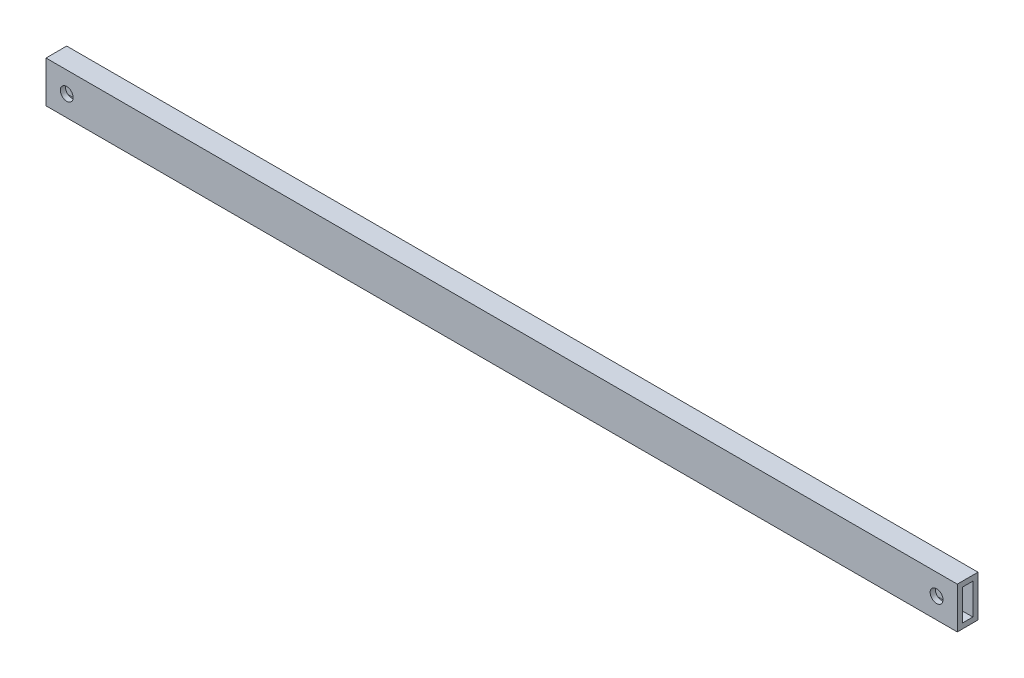
ISO-10303-21;
HEADER;
FILE_DESCRIPTION(('STEP AP214'),'2;1');
FILE_NAME('part.step','',(''),(''),'','','');
FILE_SCHEMA(('AUTOMOTIVE_DESIGN { 1 0 10303 214 1 1 1 1 }'));
ENDSEC;
DATA;
#1=APPLICATION_CONTEXT('core data for automotive mechanical design processes');
#2=APPLICATION_PROTOCOL_DEFINITION('international standard','automotive_design',2000,#1);
#3=PRODUCT_CONTEXT('',#1,'mechanical');
#4=PRODUCT('Part','Part','',(#3));
#5=PRODUCT_RELATED_PRODUCT_CATEGORY('part','',(#4));
#6=PRODUCT_DEFINITION_FORMATION('','',#4);
#7=PRODUCT_DEFINITION_CONTEXT('part definition',#1,'design');
#8=PRODUCT_DEFINITION('design','',#6,#7);
#9=PRODUCT_DEFINITION_SHAPE('','',#8);
#10=(LENGTH_UNIT() NAMED_UNIT(*) SI_UNIT(.MILLI.,.METRE.));
#11=(NAMED_UNIT(*) PLANE_ANGLE_UNIT() SI_UNIT($,.RADIAN.));
#12=(NAMED_UNIT(*) SI_UNIT($,.STERADIAN.) SOLID_ANGLE_UNIT());
#13=UNCERTAINTY_MEASURE_WITH_UNIT(LENGTH_MEASURE(1.E-05),#10,'distance_accuracy_value','');
#14=(GEOMETRIC_REPRESENTATION_CONTEXT(3) GLOBAL_UNCERTAINTY_ASSIGNED_CONTEXT((#13)) GLOBAL_UNIT_ASSIGNED_CONTEXT((#10,
#11,#12)) REPRESENTATION_CONTEXT('',''));
#15=CARTESIAN_POINT('',(0.,0.,0.));
#16=DIRECTION('',(0.,0.,1.));
#17=DIRECTION('',(1.,0.,0.));
#18=AXIS2_PLACEMENT_3D('',#15,#16,#17);
#19=CARTESIAN_POINT('',(558.8,0.,0.));
#20=DIRECTION('',(-1.,0.,0.));
#21=DIRECTION('',(0.,0.,1.));
#22=AXIS2_PLACEMENT_3D('',#19,#20,#21);
#23=PLANE('',#22);
#24=DIRECTION('',(0.,1.,0.));
#25=VECTOR('',#24,1.);
#26=CARTESIAN_POINT('',(558.8,-12.7,-6.35));
#27=LINE('',#26,#25);
#28=CARTESIAN_POINT('',(558.8,-12.7,-6.35));
#29=VERTEX_POINT('',#28);
#30=CARTESIAN_POINT('',(558.8,12.7,-6.35));
#31=VERTEX_POINT('',#30);
#32=EDGE_CURVE('E146',#29,#31,#27,.T.);
#33=ORIENTED_EDGE('',*,*,#32,.T.);
#34=DIRECTION('',(0.,0.,1.));
#35=VECTOR('',#34,1.);
#36=CARTESIAN_POINT('',(558.8,12.7,6.35));
#37=LINE('',#36,#35);
#38=CARTESIAN_POINT('',(558.8,12.7,6.35));
#39=VERTEX_POINT('',#38);
#40=EDGE_CURVE('E149',#31,#39,#37,.T.);
#41=ORIENTED_EDGE('',*,*,#40,.T.);
#42=DIRECTION('',(0.,-1.,0.));
#43=VECTOR('',#42,1.);
#44=CARTESIAN_POINT('',(558.8,-12.7,6.35));
#45=LINE('',#44,#43);
#46=CARTESIAN_POINT('',(558.8,-12.7,6.35));
#47=VERTEX_POINT('',#46);
#48=EDGE_CURVE('E152',#39,#47,#45,.T.);
#49=ORIENTED_EDGE('',*,*,#48,.T.);
#50=DIRECTION('',(0.,0.,-1.));
#51=VECTOR('',#50,1.);
#52=CARTESIAN_POINT('',(558.8,-12.7,6.35));
#53=LINE('',#52,#51);
#54=EDGE_CURVE('E154',#47,#29,#53,.T.);
#55=ORIENTED_EDGE('',*,*,#54,.T.);
#56=EDGE_LOOP('',(#33,#41,#49,#55));
#57=FACE_BOUND('',#56,.T.);
#58=DIRECTION('',(0.,-1.,0.));
#59=VECTOR('',#58,1.);
#60=CARTESIAN_POINT('',(558.8,-9.525,3.175));
#61=LINE('',#60,#59);
#62=CARTESIAN_POINT('',(558.8,9.525,3.175));
#63=VERTEX_POINT('',#62);
#64=CARTESIAN_POINT('',(558.8,-9.525,3.175));
#65=VERTEX_POINT('',#64);
#66=EDGE_CURVE('E104',#63,#65,#61,.T.);
#67=ORIENTED_EDGE('',*,*,#66,.F.);
#68=DIRECTION('',(0.,0.,1.));
#69=VECTOR('',#68,1.);
#70=CARTESIAN_POINT('',(558.8,9.525,3.175));
#71=LINE('',#70,#69);
#72=CARTESIAN_POINT('',(558.8,9.525,-3.175));
#73=VERTEX_POINT('',#72);
#74=EDGE_CURVE('E127',#73,#63,#71,.T.);
#75=ORIENTED_EDGE('',*,*,#74,.F.);
#76=DIRECTION('',(0.,1.,0.));
#77=VECTOR('',#76,1.);
#78=CARTESIAN_POINT('',(558.8,-9.525,-3.175));
#79=LINE('',#78,#77);
#80=CARTESIAN_POINT('',(558.8,-9.525,-3.175));
#81=VERTEX_POINT('',#80);
#82=EDGE_CURVE('E125',#81,#73,#79,.T.);
#83=ORIENTED_EDGE('',*,*,#82,.F.);
#84=DIRECTION('',(0.,0.,-1.));
#85=VECTOR('',#84,1.);
#86=CARTESIAN_POINT('',(558.8,-9.525,3.175));
#87=LINE('',#86,#85);
#88=EDGE_CURVE('E112',#65,#81,#87,.T.);
#89=ORIENTED_EDGE('',*,*,#88,.F.);
#90=EDGE_LOOP('',(#67,#75,#83,#89));
#91=FACE_BOUND('',#90,.T.);
#92=ADVANCED_FACE('F36',(#57,#91),#23,.F.);
#93=CARTESIAN_POINT('',(0.,0.,0.));
#94=DIRECTION('',(-1.,0.,0.));
#95=DIRECTION('',(0.,0.,1.));
#96=AXIS2_PLACEMENT_3D('',#93,#94,#95);
#97=PLANE('',#96);
#98=DIRECTION('',(0.,1.,0.));
#99=VECTOR('',#98,1.);
#100=CARTESIAN_POINT('',(0.,-12.7,-6.35));
#101=LINE('',#100,#99);
#102=CARTESIAN_POINT('',(0.,-12.7,-6.35));
#103=VERTEX_POINT('',#102);
#104=CARTESIAN_POINT('',(0.,12.7,-6.35));
#105=VERTEX_POINT('',#104);
#106=EDGE_CURVE('E121',#103,#105,#101,.T.);
#107=ORIENTED_EDGE('',*,*,#106,.F.);
#108=DIRECTION('',(0.,0.,-1.));
#109=VECTOR('',#108,1.);
#110=CARTESIAN_POINT('',(0.,-12.7,6.35));
#111=LINE('',#110,#109);
#112=CARTESIAN_POINT('',(0.,-12.7,6.35));
#113=VERTEX_POINT('',#112);
#114=EDGE_CURVE('E150',#113,#103,#111,.T.);
#115=ORIENTED_EDGE('',*,*,#114,.F.);
#116=DIRECTION('',(0.,-1.,0.));
#117=VECTOR('',#116,1.);
#118=CARTESIAN_POINT('',(0.,-12.7,6.35));
#119=LINE('',#118,#117);
#120=CARTESIAN_POINT('',(0.,12.7,6.35));
#121=VERTEX_POINT('',#120);
#122=EDGE_CURVE('E161',#121,#113,#119,.T.);
#123=ORIENTED_EDGE('',*,*,#122,.F.);
#124=DIRECTION('',(0.,0.,1.));
#125=VECTOR('',#124,1.);
#126=CARTESIAN_POINT('',(0.,12.7,6.35));
#127=LINE('',#126,#125);
#128=EDGE_CURVE('E159',#105,#121,#127,.T.);
#129=ORIENTED_EDGE('',*,*,#128,.F.);
#130=EDGE_LOOP('',(#107,#115,#123,#129));
#131=FACE_BOUND('',#130,.T.);
#132=DIRECTION('',(0.,0.,1.));
#133=VECTOR('',#132,1.);
#134=CARTESIAN_POINT('',(0.,9.525,3.175));
#135=LINE('',#134,#133);
#136=CARTESIAN_POINT('',(0.,9.525,-3.175));
#137=VERTEX_POINT('',#136);
#138=CARTESIAN_POINT('',(0.,9.525,3.175));
#139=VERTEX_POINT('',#138);
#140=EDGE_CURVE('E113',#137,#139,#135,.T.);
#141=ORIENTED_EDGE('',*,*,#140,.T.);
#142=DIRECTION('',(0.,-1.,0.));
#143=VECTOR('',#142,1.);
#144=CARTESIAN_POINT('',(0.,-9.525,3.175));
#145=LINE('',#144,#143);
#146=CARTESIAN_POINT('',(0.,-9.525,3.175));
#147=VERTEX_POINT('',#146);
#148=EDGE_CURVE('E62',#139,#147,#145,.T.);
#149=ORIENTED_EDGE('',*,*,#148,.T.);
#150=DIRECTION('',(0.,0.,-1.));
#151=VECTOR('',#150,1.);
#152=CARTESIAN_POINT('',(0.,-9.525,3.175));
#153=LINE('',#152,#151);
#154=CARTESIAN_POINT('',(0.,-9.525,-3.175));
#155=VERTEX_POINT('',#154);
#156=EDGE_CURVE('E119',#147,#155,#153,.T.);
#157=ORIENTED_EDGE('',*,*,#156,.T.);
#158=DIRECTION('',(0.,1.,0.));
#159=VECTOR('',#158,1.);
#160=CARTESIAN_POINT('',(0.,-9.525,-3.175));
#161=LINE('',#160,#159);
#162=EDGE_CURVE('E135',#155,#137,#161,.T.);
#163=ORIENTED_EDGE('',*,*,#162,.T.);
#164=EDGE_LOOP('',(#141,#149,#157,#163));
#165=FACE_BOUND('',#164,.T.);
#166=ADVANCED_FACE('F218',(#131,#165),#97,.T.);
#167=CARTESIAN_POINT('',(558.8,-12.7,-6.35));
#168=DIRECTION('',(0.,0.,1.));
#169=DIRECTION('',(1.,0.,0.));
#170=AXIS2_PLACEMENT_3D('',#167,#168,#169);
#171=PLANE('',#170);
#172=CARTESIAN_POINT('',(12.7000000000056,0.,-6.35));
#173=DIRECTION('',(0.,0.,1.));
#174=DIRECTION('',(-1.,0.,0.));
#175=AXIS2_PLACEMENT_3D('',#172,#173,#174);
#176=CIRCLE('',#175,3.35279999999993);
#177=CARTESIAN_POINT('',(9.34720000000566,0.,-6.35));
#178=VERTEX_POINT('',#177);
#179=EDGE_CURVE('E181',#178,#178,#176,.T.);
#180=ORIENTED_EDGE('',*,*,#179,.T.);
#181=EDGE_LOOP('',(#180));
#182=FACE_BOUND('',#181,.T.);
#183=CARTESIAN_POINT('',(546.099999999994,0.,-6.35));
#184=DIRECTION('',(0.,0.,1.));
#185=DIRECTION('',(1.,0.,0.));
#186=AXIS2_PLACEMENT_3D('',#183,#184,#185);
#187=CIRCLE('',#186,3.35279999999993);
#188=CARTESIAN_POINT('',(549.452799999994,0.,-6.35));
#189=VERTEX_POINT('',#188);
#190=EDGE_CURVE('E174',#189,#189,#187,.T.);
#191=ORIENTED_EDGE('',*,*,#190,.T.);
#192=EDGE_LOOP('',(#191));
#193=FACE_BOUND('',#192,.T.);
#194=ORIENTED_EDGE('',*,*,#106,.T.);
#195=DIRECTION('',(-1.,0.,0.));
#196=VECTOR('',#195,1.);
#197=CARTESIAN_POINT('',(558.8,12.7,-6.35));
#198=LINE('',#197,#196);
#199=EDGE_CURVE('E11',#31,#105,#198,.T.);
#200=ORIENTED_EDGE('',*,*,#199,.F.);
#201=ORIENTED_EDGE('',*,*,#32,.F.);
#202=DIRECTION('',(-1.,0.,0.));
#203=VECTOR('',#202,1.);
#204=CARTESIAN_POINT('',(558.8,-12.7,-6.35));
#205=LINE('',#204,#203);
#206=EDGE_CURVE('E156',#29,#103,#205,.T.);
#207=ORIENTED_EDGE('',*,*,#206,.T.);
#208=EDGE_LOOP('',(#194,#200,#201,#207));
#209=FACE_BOUND('',#208,.T.);
#210=ADVANCED_FACE('F38',(#182,#193,#209),#171,.F.);
#211=CARTESIAN_POINT('',(558.8,12.7,6.35));
#212=DIRECTION('',(0.,-1.,0.));
#213=DIRECTION('',(0.,0.,-1.));
#214=AXIS2_PLACEMENT_3D('',#211,#212,#213);
#215=PLANE('',#214);
#216=ORIENTED_EDGE('',*,*,#128,.T.);
#217=DIRECTION('',(-1.,0.,0.));
#218=VECTOR('',#217,1.);
#219=CARTESIAN_POINT('',(558.8,12.7,6.35));
#220=LINE('',#219,#218);
#221=EDGE_CURVE('E46',#39,#121,#220,.T.);
#222=ORIENTED_EDGE('',*,*,#221,.F.);
#223=ORIENTED_EDGE('',*,*,#40,.F.);
#224=ORIENTED_EDGE('',*,*,#199,.T.);
#225=EDGE_LOOP('',(#216,#222,#223,#224));
#226=FACE_BOUND('',#225,.T.);
#227=ADVANCED_FACE('F204',(#226),#215,.F.);
#228=CARTESIAN_POINT('',(558.8,-12.7,6.35));
#229=DIRECTION('',(0.,0.,-1.));
#230=DIRECTION('',(-1.,0.,0.));
#231=AXIS2_PLACEMENT_3D('',#228,#229,#230);
#232=PLANE('',#231);
#233=CARTESIAN_POINT('',(12.7000000000056,0.,6.35));
#234=DIRECTION('',(0.,0.,1.));
#235=DIRECTION('',(1.,0.,0.));
#236=AXIS2_PLACEMENT_3D('',#233,#234,#235);
#237=CIRCLE('',#236,3.937);
#238=CARTESIAN_POINT('',(16.6370000000056,0.,6.35));
#239=VERTEX_POINT('',#238);
#240=EDGE_CURVE('E189',#239,#239,#237,.T.);
#241=ORIENTED_EDGE('',*,*,#240,.F.);
#242=EDGE_LOOP('',(#241));
#243=FACE_BOUND('',#242,.T.);
#244=CARTESIAN_POINT('',(546.099999999994,0.,6.35));
#245=DIRECTION('',(0.,0.,1.));
#246=DIRECTION('',(1.,0.,0.));
#247=AXIS2_PLACEMENT_3D('',#244,#245,#246);
#248=CIRCLE('',#247,3.93700000000005);
#249=CARTESIAN_POINT('',(550.036999999994,0.,6.35));
#250=VERTEX_POINT('',#249);
#251=EDGE_CURVE('E185',#250,#250,#248,.T.);
#252=ORIENTED_EDGE('',*,*,#251,.F.);
#253=EDGE_LOOP('',(#252));
#254=FACE_BOUND('',#253,.T.);
#255=ORIENTED_EDGE('',*,*,#122,.T.);
#256=DIRECTION('',(-1.,0.,0.));
#257=VECTOR('',#256,1.);
#258=CARTESIAN_POINT('',(558.8,-12.7,6.35));
#259=LINE('',#258,#257);
#260=EDGE_CURVE('E167',#47,#113,#259,.T.);
#261=ORIENTED_EDGE('',*,*,#260,.F.);
#262=ORIENTED_EDGE('',*,*,#48,.F.);
#263=ORIENTED_EDGE('',*,*,#221,.T.);
#264=EDGE_LOOP('',(#255,#261,#262,#263));
#265=FACE_BOUND('',#264,.T.);
#266=ADVANCED_FACE('F200',(#243,#254,#265),#232,.F.);
#267=CARTESIAN_POINT('',(558.8,-12.7,6.35));
#268=DIRECTION('',(0.,1.,0.));
#269=DIRECTION('',(0.,0.,1.));
#270=AXIS2_PLACEMENT_3D('',#267,#268,#269);
#271=PLANE('',#270);
#272=ORIENTED_EDGE('',*,*,#114,.T.);
#273=ORIENTED_EDGE('',*,*,#206,.F.);
#274=ORIENTED_EDGE('',*,*,#54,.F.);
#275=ORIENTED_EDGE('',*,*,#260,.T.);
#276=EDGE_LOOP('',(#272,#273,#274,#275));
#277=FACE_BOUND('',#276,.T.);
#278=ADVANCED_FACE('F203',(#277),#271,.F.);
#279=CARTESIAN_POINT('',(558.8,-9.525,3.175));
#280=DIRECTION('',(0.,0.,-1.));
#281=DIRECTION('',(-1.,0.,0.));
#282=AXIS2_PLACEMENT_3D('',#279,#280,#281);
#283=PLANE('',#282);
#284=CARTESIAN_POINT('',(12.7000000000056,0.,3.175));
#285=DIRECTION('',(0.,0.,-1.));
#286=DIRECTION('',(-1.,0.,0.));
#287=AXIS2_PLACEMENT_3D('',#284,#285,#286);
#288=CIRCLE('',#287,3.937);
#289=CARTESIAN_POINT('',(8.7630000000056,0.,3.175));
#290=VERTEX_POINT('',#289);
#291=EDGE_CURVE('E192',#290,#290,#288,.F.);
#292=ORIENTED_EDGE('',*,*,#291,.T.);
#293=EDGE_LOOP('',(#292));
#294=FACE_BOUND('',#293,.T.);
#295=CARTESIAN_POINT('',(546.099999999994,0.,3.175));
#296=DIRECTION('',(0.,0.,-1.));
#297=DIRECTION('',(-1.,0.,0.));
#298=AXIS2_PLACEMENT_3D('',#295,#296,#297);
#299=CIRCLE('',#298,3.93700000000005);
#300=CARTESIAN_POINT('',(542.162999999994,0.,3.175));
#301=VERTEX_POINT('',#300);
#302=EDGE_CURVE('E186',#301,#301,#299,.F.);
#303=ORIENTED_EDGE('',*,*,#302,.T.);
#304=EDGE_LOOP('',(#303));
#305=FACE_BOUND('',#304,.T.);
#306=ORIENTED_EDGE('',*,*,#148,.F.);
#307=DIRECTION('',(-1.,0.,0.));
#308=VECTOR('',#307,1.);
#309=CARTESIAN_POINT('',(558.8,9.525,3.175));
#310=LINE('',#309,#308);
#311=EDGE_CURVE('E108',#63,#139,#310,.T.);
#312=ORIENTED_EDGE('',*,*,#311,.F.);
#313=ORIENTED_EDGE('',*,*,#66,.T.);
#314=DIRECTION('',(-1.,0.,0.));
#315=VECTOR('',#314,1.);
#316=CARTESIAN_POINT('',(558.8,-9.525,3.175));
#317=LINE('',#316,#315);
#318=EDGE_CURVE('E107',#65,#147,#317,.T.);
#319=ORIENTED_EDGE('',*,*,#318,.T.);
#320=EDGE_LOOP('',(#306,#312,#313,#319));
#321=FACE_BOUND('',#320,.T.);
#322=ADVANCED_FACE('F106',(#294,#305,#321),#283,.T.);
#323=CARTESIAN_POINT('',(558.8,-9.525,3.175));
#324=DIRECTION('',(0.,1.,0.));
#325=DIRECTION('',(0.,0.,1.));
#326=AXIS2_PLACEMENT_3D('',#323,#324,#325);
#327=PLANE('',#326);
#328=ORIENTED_EDGE('',*,*,#156,.F.);
#329=ORIENTED_EDGE('',*,*,#318,.F.);
#330=ORIENTED_EDGE('',*,*,#88,.T.);
#331=DIRECTION('',(-1.,0.,0.));
#332=VECTOR('',#331,1.);
#333=CARTESIAN_POINT('',(558.8,-9.525,-3.175));
#334=LINE('',#333,#332);
#335=EDGE_CURVE('E122',#81,#155,#334,.T.);
#336=ORIENTED_EDGE('',*,*,#335,.T.);
#337=EDGE_LOOP('',(#328,#329,#330,#336));
#338=FACE_BOUND('',#337,.T.);
#339=ADVANCED_FACE('F116',(#338),#327,.T.);
#340=CARTESIAN_POINT('',(558.8,-9.525,-3.175));
#341=DIRECTION('',(0.,0.,1.));
#342=DIRECTION('',(0.,-1.,0.));
#343=AXIS2_PLACEMENT_3D('',#340,#341,#342);
#344=PLANE('',#343);
#345=CARTESIAN_POINT('',(12.7000000000056,0.,-3.175));
#346=DIRECTION('',(0.,0.,1.));
#347=DIRECTION('',(0.,-1.,0.));
#348=AXIS2_PLACEMENT_3D('',#345,#346,#347);
#349=CIRCLE('',#348,3.35279999999993);
#350=CARTESIAN_POINT('',(12.7000000000056,-3.35279999999993,-3.175));
#351=VERTEX_POINT('',#350);
#352=EDGE_CURVE('E40',#351,#351,#349,.T.);
#353=ORIENTED_EDGE('',*,*,#352,.F.);
#354=EDGE_LOOP('',(#353));
#355=FACE_BOUND('',#354,.T.);
#356=CARTESIAN_POINT('',(546.099999999994,0.,-3.175));
#357=DIRECTION('',(0.,0.,1.));
#358=DIRECTION('',(0.,-1.,0.));
#359=AXIS2_PLACEMENT_3D('',#356,#357,#358);
#360=CIRCLE('',#359,3.35279999999993);
#361=CARTESIAN_POINT('',(546.099999999994,-3.35279999999993,-3.175));
#362=VERTEX_POINT('',#361);
#363=EDGE_CURVE('E133',#362,#362,#360,.T.);
#364=ORIENTED_EDGE('',*,*,#363,.F.);
#365=EDGE_LOOP('',(#364));
#366=FACE_BOUND('',#365,.T.);
#367=ORIENTED_EDGE('',*,*,#162,.F.);
#368=ORIENTED_EDGE('',*,*,#335,.F.);
#369=ORIENTED_EDGE('',*,*,#82,.T.);
#370=DIRECTION('',(-1.,0.,0.));
#371=VECTOR('',#370,1.);
#372=CARTESIAN_POINT('',(558.8,9.525,-3.175));
#373=LINE('',#372,#371);
#374=EDGE_CURVE('E54',#73,#137,#373,.T.);
#375=ORIENTED_EDGE('',*,*,#374,.T.);
#376=EDGE_LOOP('',(#367,#368,#369,#375));
#377=FACE_BOUND('',#376,.T.);
#378=ADVANCED_FACE('F247',(#355,#366,#377),#344,.T.);
#379=CARTESIAN_POINT('',(558.8,9.525,3.175));
#380=DIRECTION('',(0.,-1.,0.));
#381=DIRECTION('',(0.,0.,-1.));
#382=AXIS2_PLACEMENT_3D('',#379,#380,#381);
#383=PLANE('',#382);
#384=ORIENTED_EDGE('',*,*,#140,.F.);
#385=ORIENTED_EDGE('',*,*,#374,.F.);
#386=ORIENTED_EDGE('',*,*,#74,.T.);
#387=ORIENTED_EDGE('',*,*,#311,.T.);
#388=EDGE_LOOP('',(#384,#385,#386,#387));
#389=FACE_BOUND('',#388,.T.);
#390=ADVANCED_FACE('F269',(#389),#383,.T.);
#391=CARTESIAN_POINT('',(546.099999999994,0.,-6.35));
#392=DIRECTION('',(0.,0.,1.));
#393=DIRECTION('',(1.,0.,0.));
#394=AXIS2_PLACEMENT_3D('',#391,#392,#393);
#395=CYLINDRICAL_SURFACE('',#394,3.35279999999993);
#396=ORIENTED_EDGE('',*,*,#363,.T.);
#397=EDGE_LOOP('',(#396));
#398=FACE_BOUND('',#397,.T.);
#399=ORIENTED_EDGE('',*,*,#190,.F.);
#400=EDGE_LOOP('',(#399));
#401=FACE_BOUND('',#400,.T.);
#402=ADVANCED_FACE('F263',(#398,#401),#395,.F.);
#403=CARTESIAN_POINT('',(12.7000000000056,0.,-6.35));
#404=DIRECTION('',(0.,0.,1.));
#405=DIRECTION('',(1.,0.,0.));
#406=AXIS2_PLACEMENT_3D('',#403,#404,#405);
#407=CYLINDRICAL_SURFACE('',#406,3.35279999999993);
#408=ORIENTED_EDGE('',*,*,#352,.T.);
#409=EDGE_LOOP('',(#408));
#410=FACE_BOUND('',#409,.T.);
#411=ORIENTED_EDGE('',*,*,#179,.F.);
#412=EDGE_LOOP('',(#411));
#413=FACE_BOUND('',#412,.T.);
#414=ADVANCED_FACE('F255',(#410,#413),#407,.F.);
#415=CARTESIAN_POINT('',(546.099999999994,0.,-6.351));
#416=DIRECTION('',(0.,0.,1.));
#417=DIRECTION('',(1.,0.,0.));
#418=AXIS2_PLACEMENT_3D('',#415,#416,#417);
#419=CYLINDRICAL_SURFACE('',#418,3.93700000000005);
#420=ORIENTED_EDGE('',*,*,#302,.F.);
#421=EDGE_LOOP('',(#420));
#422=FACE_BOUND('',#421,.T.);
#423=ORIENTED_EDGE('',*,*,#251,.T.);
#424=EDGE_LOOP('',(#423));
#425=FACE_BOUND('',#424,.T.);
#426=ADVANCED_FACE('F252',(#422,#425),#419,.F.);
#427=CARTESIAN_POINT('',(12.7000000000056,0.,-6.351));
#428=DIRECTION('',(0.,0.,1.));
#429=DIRECTION('',(1.,0.,0.));
#430=AXIS2_PLACEMENT_3D('',#427,#428,#429);
#431=CYLINDRICAL_SURFACE('',#430,3.937);
#432=ORIENTED_EDGE('',*,*,#291,.F.);
#433=EDGE_LOOP('',(#432));
#434=FACE_BOUND('',#433,.T.);
#435=ORIENTED_EDGE('',*,*,#240,.T.);
#436=EDGE_LOOP('',(#435));
#437=FACE_BOUND('',#436,.T.);
#438=ADVANCED_FACE('F198',(#434,#437),#431,.F.);
#439=CLOSED_SHELL('',(#92,#166,#210,#227,#266,#278,#322,#339,#378,#390,#402,#414,#426,#438));
#440=MANIFOLD_SOLID_BREP('B2',#439);
#441=ADVANCED_BREP_SHAPE_REPRESENTATION('',(#18,#440),#14);
#442=SHAPE_DEFINITION_REPRESENTATION(#9,#441);
ENDSEC;
END-ISO-10303-21;
